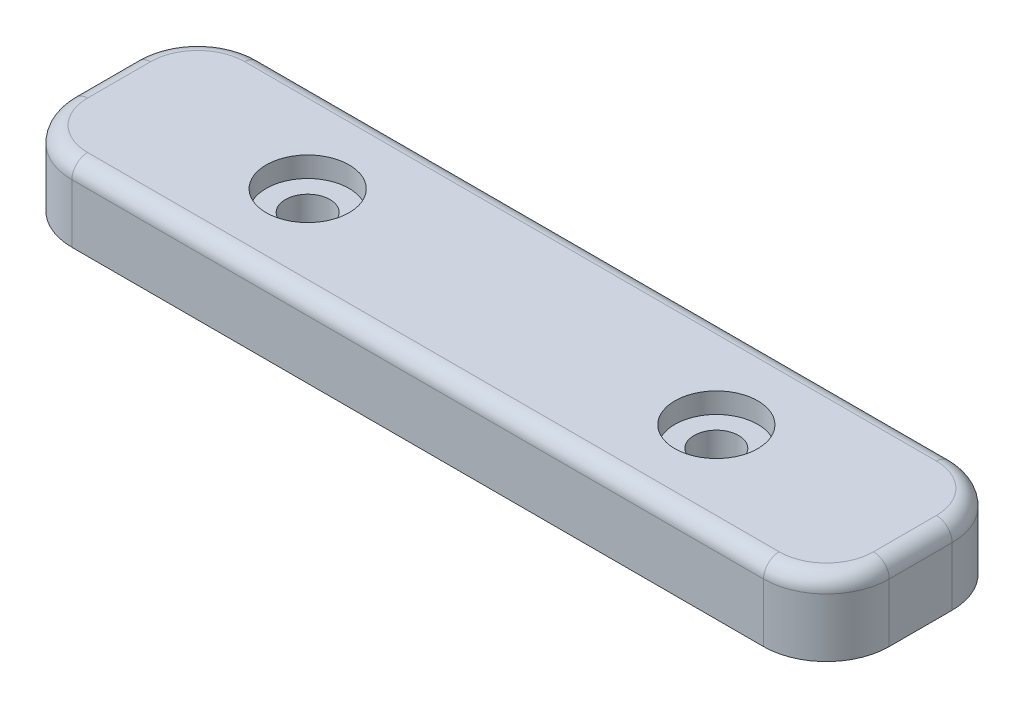
ISO-10303-21;
HEADER;
FILE_DESCRIPTION(('STEP AP214'),'2;1');
FILE_NAME('part.step','',(''),(''),'','','');
FILE_SCHEMA(('AUTOMOTIVE_DESIGN { 1 0 10303 214 1 1 1 1 }'));
ENDSEC;
DATA;
#1=APPLICATION_CONTEXT('core data for automotive mechanical design processes');
#2=APPLICATION_PROTOCOL_DEFINITION('international standard','automotive_design',2000,#1);
#3=PRODUCT_CONTEXT('',#1,'mechanical');
#4=PRODUCT('Part','Part','',(#3));
#5=PRODUCT_RELATED_PRODUCT_CATEGORY('part','',(#4));
#6=PRODUCT_DEFINITION_FORMATION('','',#4);
#7=PRODUCT_DEFINITION_CONTEXT('part definition',#1,'design');
#8=PRODUCT_DEFINITION('design','',#6,#7);
#9=PRODUCT_DEFINITION_SHAPE('','',#8);
#10=(LENGTH_UNIT() NAMED_UNIT(*) SI_UNIT(.MILLI.,.METRE.));
#11=(NAMED_UNIT(*) PLANE_ANGLE_UNIT() SI_UNIT($,.RADIAN.));
#12=(NAMED_UNIT(*) SI_UNIT($,.STERADIAN.) SOLID_ANGLE_UNIT());
#13=UNCERTAINTY_MEASURE_WITH_UNIT(LENGTH_MEASURE(1.E-05),#10,'distance_accuracy_value','');
#14=(GEOMETRIC_REPRESENTATION_CONTEXT(3) GLOBAL_UNCERTAINTY_ASSIGNED_CONTEXT((#13)) GLOBAL_UNIT_ASSIGNED_CONTEXT((#10,
#11,#12)) REPRESENTATION_CONTEXT('',''));
#15=CARTESIAN_POINT('',(0.,0.,0.));
#16=DIRECTION('',(0.,0.,1.));
#17=DIRECTION('',(1.,0.,0.));
#18=AXIS2_PLACEMENT_3D('',#15,#16,#17);
#19=CARTESIAN_POINT('',(0.,6.,0.));
#20=DIRECTION('',(1.,0.,0.));
#21=DIRECTION('',(0.,0.,-1.));
#22=AXIS2_PLACEMENT_3D('',#19,#20,#21);
#23=PLANE('',#22);
#24=DIRECTION('',(0.,-1.,0.));
#25=VECTOR('',#24,1.);
#26=CARTESIAN_POINT('',(0.,6.,10.16));
#27=LINE('',#26,#25);
#28=CARTESIAN_POINT('',(0.,0.,10.16));
#29=VERTEX_POINT('',#28);
#30=CARTESIAN_POINT('',(0.,4.73,10.16));
#31=VERTEX_POINT('',#30);
#32=EDGE_CURVE('E143',#29,#31,#27,.F.);
#33=ORIENTED_EDGE('',*,*,#32,.T.);
#34=DIRECTION('',(0.,0.,1.));
#35=VECTOR('',#34,1.);
#36=CARTESIAN_POINT('',(0.,4.73,5.08));
#37=LINE('',#36,#35);
#38=CARTESIAN_POINT('',(0.,4.73,5.08));
#39=VERTEX_POINT('',#38);
#40=EDGE_CURVE('E200',#31,#39,#37,.F.);
#41=ORIENTED_EDGE('',*,*,#40,.T.);
#42=DIRECTION('',(0.,-1.,0.));
#43=VECTOR('',#42,1.);
#44=CARTESIAN_POINT('',(0.,6.,5.08));
#45=LINE('',#44,#43);
#46=CARTESIAN_POINT('',(0.,0.,5.08));
#47=VERTEX_POINT('',#46);
#48=EDGE_CURVE('E147',#39,#47,#45,.T.);
#49=ORIENTED_EDGE('',*,*,#48,.T.);
#50=DIRECTION('',(0.,0.,1.));
#51=VECTOR('',#50,1.);
#52=CARTESIAN_POINT('',(0.,0.,0.));
#53=LINE('',#52,#51);
#54=EDGE_CURVE('E155',#47,#29,#53,.T.);
#55=ORIENTED_EDGE('',*,*,#54,.T.);
#56=EDGE_LOOP('',(#33,#41,#49,#55));
#57=FACE_BOUND('',#56,.T.);
#58=ADVANCED_FACE('F36',(#57),#23,.F.);
#59=CARTESIAN_POINT('',(0.,6.,15.24));
#60=DIRECTION('',(0.,0.,-1.));
#61=DIRECTION('',(-1.,0.,0.));
#62=AXIS2_PLACEMENT_3D('',#59,#60,#61);
#63=PLANE('',#62);
#64=DIRECTION('',(0.,-1.,0.));
#65=VECTOR('',#64,1.);
#66=CARTESIAN_POINT('',(60.96,6.,15.24));
#67=LINE('',#66,#65);
#68=CARTESIAN_POINT('',(60.96,0.,15.24));
#69=VERTEX_POINT('',#68);
#70=CARTESIAN_POINT('',(60.96,4.73,15.24));
#71=VERTEX_POINT('',#70);
#72=EDGE_CURVE('E137',#69,#71,#67,.F.);
#73=ORIENTED_EDGE('',*,*,#72,.T.);
#74=DIRECTION('',(1.,0.,0.));
#75=VECTOR('',#74,1.);
#76=CARTESIAN_POINT('',(5.08,4.73,15.24));
#77=LINE('',#76,#75);
#78=CARTESIAN_POINT('',(5.08,4.73,15.24));
#79=VERTEX_POINT('',#78);
#80=EDGE_CURVE('E11',#71,#79,#77,.F.);
#81=ORIENTED_EDGE('',*,*,#80,.T.);
#82=DIRECTION('',(0.,-1.,0.));
#83=VECTOR('',#82,1.);
#84=CARTESIAN_POINT('',(5.08,6.,15.24));
#85=LINE('',#84,#83);
#86=CARTESIAN_POINT('',(5.08,0.,15.24));
#87=VERTEX_POINT('',#86);
#88=EDGE_CURVE('E127',#79,#87,#85,.T.);
#89=ORIENTED_EDGE('',*,*,#88,.T.);
#90=DIRECTION('',(1.,0.,0.));
#91=VECTOR('',#90,1.);
#92=CARTESIAN_POINT('',(0.,0.,15.24));
#93=LINE('',#92,#91);
#94=EDGE_CURVE('E131',#87,#69,#93,.T.);
#95=ORIENTED_EDGE('',*,*,#94,.T.);
#96=EDGE_LOOP('',(#73,#81,#89,#95));
#97=FACE_BOUND('',#96,.T.);
#98=ADVANCED_FACE('F129',(#97),#63,.F.);
#99=CARTESIAN_POINT('',(66.04,6.,0.));
#100=DIRECTION('',(-1.,0.,0.));
#101=DIRECTION('',(0.,0.,1.));
#102=AXIS2_PLACEMENT_3D('',#99,#100,#101);
#103=PLANE('',#102);
#104=DIRECTION('',(0.,-1.,0.));
#105=VECTOR('',#104,1.);
#106=CARTESIAN_POINT('',(66.04,6.,5.08));
#107=LINE('',#106,#105);
#108=CARTESIAN_POINT('',(66.04,0.,5.08));
#109=VERTEX_POINT('',#108);
#110=CARTESIAN_POINT('',(66.04,4.73,5.08));
#111=VERTEX_POINT('',#110);
#112=EDGE_CURVE('E177',#109,#111,#107,.F.);
#113=ORIENTED_EDGE('',*,*,#112,.T.);
#114=DIRECTION('',(0.,0.,-1.));
#115=VECTOR('',#114,1.);
#116=CARTESIAN_POINT('',(66.04,4.73,10.16));
#117=LINE('',#116,#115);
#118=CARTESIAN_POINT('',(66.04,4.73,10.16));
#119=VERTEX_POINT('',#118);
#120=EDGE_CURVE('E60',#111,#119,#117,.F.);
#121=ORIENTED_EDGE('',*,*,#120,.T.);
#122=DIRECTION('',(0.,-1.,0.));
#123=VECTOR('',#122,1.);
#124=CARTESIAN_POINT('',(66.04,6.,10.16));
#125=LINE('',#124,#123);
#126=CARTESIAN_POINT('',(66.04,0.,10.16));
#127=VERTEX_POINT('',#126);
#128=EDGE_CURVE('E179',#119,#127,#125,.T.);
#129=ORIENTED_EDGE('',*,*,#128,.T.);
#130=DIRECTION('',(0.,0.,-1.));
#131=VECTOR('',#130,1.);
#132=CARTESIAN_POINT('',(66.04,0.,0.));
#133=LINE('',#132,#131);
#134=EDGE_CURVE('E154',#127,#109,#133,.T.);
#135=ORIENTED_EDGE('',*,*,#134,.T.);
#136=EDGE_LOOP('',(#113,#121,#129,#135));
#137=FACE_BOUND('',#136,.T.);
#138=ADVANCED_FACE('F292',(#137),#103,.F.);
#139=CARTESIAN_POINT('',(0.,6.,0.));
#140=DIRECTION('',(0.,0.,1.));
#141=DIRECTION('',(1.,0.,0.));
#142=AXIS2_PLACEMENT_3D('',#139,#140,#141);
#143=PLANE('',#142);
#144=DIRECTION('',(0.,-1.,0.));
#145=VECTOR('',#144,1.);
#146=CARTESIAN_POINT('',(5.08,6.,0.));
#147=LINE('',#146,#145);
#148=CARTESIAN_POINT('',(5.08,0.,0.));
#149=VERTEX_POINT('',#148);
#150=CARTESIAN_POINT('',(5.08,4.73,0.));
#151=VERTEX_POINT('',#150);
#152=EDGE_CURVE('E174',#149,#151,#147,.F.);
#153=ORIENTED_EDGE('',*,*,#152,.T.);
#154=DIRECTION('',(-1.,0.,0.));
#155=VECTOR('',#154,1.);
#156=CARTESIAN_POINT('',(60.96,4.73,0.));
#157=LINE('',#156,#155);
#158=CARTESIAN_POINT('',(60.96,4.73,0.));
#159=VERTEX_POINT('',#158);
#160=EDGE_CURVE('E204',#151,#159,#157,.F.);
#161=ORIENTED_EDGE('',*,*,#160,.T.);
#162=DIRECTION('',(0.,-1.,0.));
#163=VECTOR('',#162,1.);
#164=CARTESIAN_POINT('',(60.96,6.,0.));
#165=LINE('',#164,#163);
#166=CARTESIAN_POINT('',(60.96,0.,0.));
#167=VERTEX_POINT('',#166);
#168=EDGE_CURVE('E172',#159,#167,#165,.T.);
#169=ORIENTED_EDGE('',*,*,#168,.T.);
#170=DIRECTION('',(-1.,0.,0.));
#171=VECTOR('',#170,1.);
#172=CARTESIAN_POINT('',(0.,0.,0.));
#173=LINE('',#172,#171);
#174=EDGE_CURVE('E158',#167,#149,#173,.T.);
#175=ORIENTED_EDGE('',*,*,#174,.T.);
#176=EDGE_LOOP('',(#153,#161,#169,#175));
#177=FACE_BOUND('',#176,.T.);
#178=ADVANCED_FACE('F283',(#177),#143,.F.);
#179=CARTESIAN_POINT('',(0.,6.,0.));
#180=DIRECTION('',(0.,1.,0.));
#181=DIRECTION('',(0.,0.,1.));
#182=AXIS2_PLACEMENT_3D('',#179,#180,#181);
#183=PLANE('',#182);
#184=DIRECTION('',(0.,0.,1.));
#185=VECTOR('',#184,1.);
#186=CARTESIAN_POINT('',(1.27,6.,10.16));
#187=LINE('',#186,#185);
#188=CARTESIAN_POINT('',(1.27,6.,5.08));
#189=VERTEX_POINT('',#188);
#190=CARTESIAN_POINT('',(1.27,6.,10.16));
#191=VERTEX_POINT('',#190);
#192=EDGE_CURVE('E193',#189,#191,#187,.T.);
#193=ORIENTED_EDGE('',*,*,#192,.T.);
#194=CARTESIAN_POINT('',(5.08,6.,10.16));
#195=DIRECTION('',(0.,1.,0.));
#196=DIRECTION('',(0.,0.,1.));
#197=AXIS2_PLACEMENT_3D('',#194,#195,#196);
#198=CIRCLE('',#197,3.81);
#199=CARTESIAN_POINT('',(5.08,6.,13.97));
#200=VERTEX_POINT('',#199);
#201=EDGE_CURVE('E195',#191,#200,#198,.T.);
#202=ORIENTED_EDGE('',*,*,#201,.T.);
#203=DIRECTION('',(1.,0.,0.));
#204=VECTOR('',#203,1.);
#205=CARTESIAN_POINT('',(60.96,6.,13.97));
#206=LINE('',#205,#204);
#207=CARTESIAN_POINT('',(60.96,6.,13.97));
#208=VERTEX_POINT('',#207);
#209=EDGE_CURVE('E181',#200,#208,#206,.T.);
#210=ORIENTED_EDGE('',*,*,#209,.T.);
#211=CARTESIAN_POINT('',(60.96,6.,10.16));
#212=DIRECTION('',(0.,1.,0.));
#213=DIRECTION('',(0.,0.,1.));
#214=AXIS2_PLACEMENT_3D('',#211,#212,#213);
#215=CIRCLE('',#214,3.81);
#216=CARTESIAN_POINT('',(64.77,6.,10.16));
#217=VERTEX_POINT('',#216);
#218=EDGE_CURVE('E183',#208,#217,#215,.T.);
#219=ORIENTED_EDGE('',*,*,#218,.T.);
#220=DIRECTION('',(0.,0.,-1.));
#221=VECTOR('',#220,1.);
#222=CARTESIAN_POINT('',(64.77,6.,5.08));
#223=LINE('',#222,#221);
#224=CARTESIAN_POINT('',(64.77,6.,5.08));
#225=VERTEX_POINT('',#224);
#226=EDGE_CURVE('E185',#217,#225,#223,.T.);
#227=ORIENTED_EDGE('',*,*,#226,.T.);
#228=CARTESIAN_POINT('',(60.96,6.,5.08));
#229=DIRECTION('',(0.,1.,0.));
#230=DIRECTION('',(0.,0.,1.));
#231=AXIS2_PLACEMENT_3D('',#228,#229,#230);
#232=CIRCLE('',#231,3.81);
#233=CARTESIAN_POINT('',(60.96,6.,1.27));
#234=VERTEX_POINT('',#233);
#235=EDGE_CURVE('E187',#225,#234,#232,.T.);
#236=ORIENTED_EDGE('',*,*,#235,.T.);
#237=DIRECTION('',(-1.,0.,0.));
#238=VECTOR('',#237,1.);
#239=CARTESIAN_POINT('',(5.08,6.,1.27));
#240=LINE('',#239,#238);
#241=CARTESIAN_POINT('',(5.08,6.,1.27));
#242=VERTEX_POINT('',#241);
#243=EDGE_CURVE('E189',#234,#242,#240,.T.);
#244=ORIENTED_EDGE('',*,*,#243,.T.);
#245=CARTESIAN_POINT('',(5.08,6.,5.08));
#246=DIRECTION('',(0.,1.,0.));
#247=DIRECTION('',(0.,0.,1.));
#248=AXIS2_PLACEMENT_3D('',#245,#246,#247);
#249=CIRCLE('',#248,3.81);
#250=EDGE_CURVE('E191',#242,#189,#249,.T.);
#251=ORIENTED_EDGE('',*,*,#250,.T.);
#252=EDGE_LOOP('',(#193,#202,#210,#219,#227,#236,#244,#251));
#253=FACE_BOUND('',#252,.T.);
#254=CARTESIAN_POINT('',(16.51,6.,7.62));
#255=DIRECTION('',(0.,1.,0.));
#256=DIRECTION('',(0.,0.,1.));
#257=AXIS2_PLACEMENT_3D('',#254,#255,#256);
#258=CIRCLE('',#257,3.35);
#259=CARTESIAN_POINT('',(16.51,6.,10.97));
#260=VERTEX_POINT('',#259);
#261=EDGE_CURVE('E231',#260,#260,#258,.T.);
#262=ORIENTED_EDGE('',*,*,#261,.F.);
#263=EDGE_LOOP('',(#262));
#264=FACE_BOUND('',#263,.T.);
#265=CARTESIAN_POINT('',(49.53,6.,7.62));
#266=DIRECTION('',(0.,1.,0.));
#267=DIRECTION('',(0.,0.,1.));
#268=AXIS2_PLACEMENT_3D('',#265,#266,#267);
#269=CIRCLE('',#268,3.35);
#270=CARTESIAN_POINT('',(49.53,6.,10.97));
#271=VERTEX_POINT('',#270);
#272=EDGE_CURVE('E250',#271,#271,#269,.T.);
#273=ORIENTED_EDGE('',*,*,#272,.F.);
#274=EDGE_LOOP('',(#273));
#275=FACE_BOUND('',#274,.T.);
#276=ADVANCED_FACE('F281',(#253,#264,#275),#183,.T.);
#277=CARTESIAN_POINT('',(0.,0.,0.));
#278=DIRECTION('',(0.,1.,0.));
#279=DIRECTION('',(0.,0.,1.));
#280=AXIS2_PLACEMENT_3D('',#277,#278,#279);
#281=PLANE('',#280);
#282=CARTESIAN_POINT('',(16.51,0.,7.62));
#283=DIRECTION('',(0.,1.,0.));
#284=DIRECTION('',(0.,0.,1.));
#285=AXIS2_PLACEMENT_3D('',#282,#283,#284);
#286=CIRCLE('',#285,1.8);
#287=CARTESIAN_POINT('',(16.51,0.,9.42));
#288=VERTEX_POINT('',#287);
#289=EDGE_CURVE('E247',#288,#288,#286,.T.);
#290=ORIENTED_EDGE('',*,*,#289,.T.);
#291=EDGE_LOOP('',(#290));
#292=FACE_BOUND('',#291,.T.);
#293=CARTESIAN_POINT('',(49.53,0.,7.62));
#294=DIRECTION('',(0.,1.,0.));
#295=DIRECTION('',(0.,0.,1.));
#296=AXIS2_PLACEMENT_3D('',#293,#294,#295);
#297=CIRCLE('',#296,1.8);
#298=CARTESIAN_POINT('',(49.53,0.,9.41999999999999));
#299=VERTEX_POINT('',#298);
#300=EDGE_CURVE('E160',#299,#299,#297,.T.);
#301=ORIENTED_EDGE('',*,*,#300,.T.);
#302=EDGE_LOOP('',(#301));
#303=FACE_BOUND('',#302,.T.);
#304=ORIENTED_EDGE('',*,*,#94,.F.);
#305=CARTESIAN_POINT('',(5.08,0.,10.16));
#306=DIRECTION('',(0.,1.,0.));
#307=DIRECTION('',(0.,0.,1.));
#308=AXIS2_PLACEMENT_3D('',#305,#306,#307);
#309=CIRCLE('',#308,5.08);
#310=EDGE_CURVE('E140',#87,#29,#309,.F.);
#311=ORIENTED_EDGE('',*,*,#310,.T.);
#312=ORIENTED_EDGE('',*,*,#54,.F.);
#313=CARTESIAN_POINT('',(5.08,0.,5.08));
#314=DIRECTION('',(0.,1.,0.));
#315=DIRECTION('',(0.,0.,1.));
#316=AXIS2_PLACEMENT_3D('',#313,#314,#315);
#317=CIRCLE('',#316,5.08);
#318=EDGE_CURVE('E148',#47,#149,#317,.F.);
#319=ORIENTED_EDGE('',*,*,#318,.T.);
#320=ORIENTED_EDGE('',*,*,#174,.F.);
#321=CARTESIAN_POINT('',(60.96,0.,5.08));
#322=DIRECTION('',(0.,1.,0.));
#323=DIRECTION('',(0.,0.,1.));
#324=AXIS2_PLACEMENT_3D('',#321,#322,#323);
#325=CIRCLE('',#324,5.08);
#326=EDGE_CURVE('E136',#167,#109,#325,.F.);
#327=ORIENTED_EDGE('',*,*,#326,.T.);
#328=ORIENTED_EDGE('',*,*,#134,.F.);
#329=CARTESIAN_POINT('',(60.96,0.,10.16));
#330=DIRECTION('',(0.,1.,0.));
#331=DIRECTION('',(0.,0.,1.));
#332=AXIS2_PLACEMENT_3D('',#329,#330,#331);
#333=CIRCLE('',#332,5.08);
#334=EDGE_CURVE('E153',#127,#69,#333,.F.);
#335=ORIENTED_EDGE('',*,*,#334,.T.);
#336=EDGE_LOOP('',(#304,#311,#312,#319,#320,#327,#328,#335));
#337=FACE_BOUND('',#336,.T.);
#338=ADVANCED_FACE('F150',(#292,#303,#337),#281,.F.);
#339=CARTESIAN_POINT('',(49.53,6.,7.62));
#340=DIRECTION('',(0.,1.,0.));
#341=DIRECTION('',(0.,0.,1.));
#342=AXIS2_PLACEMENT_3D('',#339,#340,#341);
#343=CYLINDRICAL_SURFACE('',#342,1.8);
#344=ORIENTED_EDGE('',*,*,#300,.F.);
#345=EDGE_LOOP('',(#344));
#346=FACE_BOUND('',#345,.T.);
#347=CARTESIAN_POINT('',(49.53,4.35,7.62));
#348=DIRECTION('',(0.,1.,0.));
#349=DIRECTION('',(0.,0.,1.));
#350=AXIS2_PLACEMENT_3D('',#347,#348,#349);
#351=CIRCLE('',#350,1.8);
#352=CARTESIAN_POINT('',(49.53,4.35,9.42));
#353=VERTEX_POINT('',#352);
#354=EDGE_CURVE('E256',#353,#353,#351,.T.);
#355=ORIENTED_EDGE('',*,*,#354,.T.);
#356=EDGE_LOOP('',(#355));
#357=FACE_BOUND('',#356,.T.);
#358=ADVANCED_FACE('F262',(#346,#357),#343,.F.);
#359=CARTESIAN_POINT('',(51.33,4.35,7.62));
#360=DIRECTION('',(0.,-1.,0.));
#361=DIRECTION('',(0.,0.,-1.));
#362=AXIS2_PLACEMENT_3D('',#359,#360,#361);
#363=PLANE('',#362);
#364=ORIENTED_EDGE('',*,*,#354,.F.);
#365=EDGE_LOOP('',(#364));
#366=FACE_BOUND('',#365,.T.);
#367=CARTESIAN_POINT('',(49.53,4.35,7.62));
#368=DIRECTION('',(0.,1.,0.));
#369=DIRECTION('',(0.,0.,1.));
#370=AXIS2_PLACEMENT_3D('',#367,#368,#369);
#371=CIRCLE('',#370,3.35);
#372=CARTESIAN_POINT('',(49.53,4.35,10.97));
#373=VERTEX_POINT('',#372);
#374=EDGE_CURVE('E253',#373,#373,#371,.T.);
#375=ORIENTED_EDGE('',*,*,#374,.T.);
#376=EDGE_LOOP('',(#375));
#377=FACE_BOUND('',#376,.T.);
#378=ADVANCED_FACE('F265',(#366,#377),#363,.F.);
#379=CARTESIAN_POINT('',(49.53,6.,7.62));
#380=DIRECTION('',(0.,1.,0.));
#381=DIRECTION('',(0.,0.,1.));
#382=AXIS2_PLACEMENT_3D('',#379,#380,#381);
#383=CYLINDRICAL_SURFACE('',#382,3.35);
#384=ORIENTED_EDGE('',*,*,#374,.F.);
#385=EDGE_LOOP('',(#384));
#386=FACE_BOUND('',#385,.T.);
#387=ORIENTED_EDGE('',*,*,#272,.T.);
#388=EDGE_LOOP('',(#387));
#389=FACE_BOUND('',#388,.T.);
#390=ADVANCED_FACE('F271',(#386,#389),#383,.F.);
#391=CARTESIAN_POINT('',(16.51,6.,7.62));
#392=DIRECTION('',(0.,1.,0.));
#393=DIRECTION('',(0.,0.,1.));
#394=AXIS2_PLACEMENT_3D('',#391,#392,#393);
#395=CYLINDRICAL_SURFACE('',#394,1.8);
#396=ORIENTED_EDGE('',*,*,#289,.F.);
#397=EDGE_LOOP('',(#396));
#398=FACE_BOUND('',#397,.T.);
#399=CARTESIAN_POINT('',(16.51,4.35,7.62));
#400=DIRECTION('',(0.,1.,0.));
#401=DIRECTION('',(0.,0.,1.));
#402=AXIS2_PLACEMENT_3D('',#399,#400,#401);
#403=CIRCLE('',#402,1.8);
#404=CARTESIAN_POINT('',(16.51,4.35,9.42));
#405=VERTEX_POINT('',#404);
#406=EDGE_CURVE('E242',#405,#405,#403,.T.);
#407=ORIENTED_EDGE('',*,*,#406,.T.);
#408=EDGE_LOOP('',(#407));
#409=FACE_BOUND('',#408,.T.);
#410=ADVANCED_FACE('F277',(#398,#409),#395,.F.);
#411=CARTESIAN_POINT('',(18.31,4.35,7.62));
#412=DIRECTION('',(0.,-1.,0.));
#413=DIRECTION('',(0.,0.,-1.));
#414=AXIS2_PLACEMENT_3D('',#411,#412,#413);
#415=PLANE('',#414);
#416=ORIENTED_EDGE('',*,*,#406,.F.);
#417=EDGE_LOOP('',(#416));
#418=FACE_BOUND('',#417,.T.);
#419=CARTESIAN_POINT('',(16.51,4.35,7.62));
#420=DIRECTION('',(0.,1.,0.));
#421=DIRECTION('',(0.,0.,1.));
#422=AXIS2_PLACEMENT_3D('',#419,#420,#421);
#423=CIRCLE('',#422,3.35);
#424=CARTESIAN_POINT('',(16.51,4.35,10.97));
#425=VERTEX_POINT('',#424);
#426=EDGE_CURVE('E237',#425,#425,#423,.T.);
#427=ORIENTED_EDGE('',*,*,#426,.T.);
#428=EDGE_LOOP('',(#427));
#429=FACE_BOUND('',#428,.T.);
#430=ADVANCED_FACE('F462',(#418,#429),#415,.F.);
#431=CARTESIAN_POINT('',(16.51,6.,7.62));
#432=DIRECTION('',(0.,1.,0.));
#433=DIRECTION('',(0.,0.,1.));
#434=AXIS2_PLACEMENT_3D('',#431,#432,#433);
#435=CYLINDRICAL_SURFACE('',#434,3.35);
#436=ORIENTED_EDGE('',*,*,#426,.F.);
#437=EDGE_LOOP('',(#436));
#438=FACE_BOUND('',#437,.T.);
#439=ORIENTED_EDGE('',*,*,#261,.T.);
#440=EDGE_LOOP('',(#439));
#441=FACE_BOUND('',#440,.T.);
#442=ADVANCED_FACE('F308',(#438,#441),#435,.F.);
#443=CARTESIAN_POINT('',(5.08,6.,10.16));
#444=DIRECTION('',(0.,-1.,0.));
#445=DIRECTION('',(0.,0.,-1.));
#446=AXIS2_PLACEMENT_3D('',#443,#444,#445);
#447=CYLINDRICAL_SURFACE('',#446,5.08);
#448=ORIENTED_EDGE('',*,*,#88,.F.);
#449=CARTESIAN_POINT('',(5.08,4.73,10.16));
#450=DIRECTION('',(0.,1.,0.));
#451=DIRECTION('',(0.,0.,1.));
#452=AXIS2_PLACEMENT_3D('',#449,#450,#451);
#453=CIRCLE('',#452,5.08);
#454=EDGE_CURVE('E198',#79,#31,#453,.F.);
#455=ORIENTED_EDGE('',*,*,#454,.T.);
#456=ORIENTED_EDGE('',*,*,#32,.F.);
#457=ORIENTED_EDGE('',*,*,#310,.F.);
#458=EDGE_LOOP('',(#448,#455,#456,#457));
#459=FACE_BOUND('',#458,.T.);
#460=ADVANCED_FACE('F141',(#459),#447,.T.);
#461=CARTESIAN_POINT('',(5.08,6.,5.08));
#462=DIRECTION('',(0.,-1.,0.));
#463=DIRECTION('',(0.,0.,-1.));
#464=AXIS2_PLACEMENT_3D('',#461,#462,#463);
#465=CYLINDRICAL_SURFACE('',#464,5.08);
#466=ORIENTED_EDGE('',*,*,#48,.F.);
#467=CARTESIAN_POINT('',(5.08,4.73,5.08));
#468=DIRECTION('',(0.,1.,0.));
#469=DIRECTION('',(0.,0.,1.));
#470=AXIS2_PLACEMENT_3D('',#467,#468,#469);
#471=CIRCLE('',#470,5.08);
#472=EDGE_CURVE('E202',#39,#151,#471,.F.);
#473=ORIENTED_EDGE('',*,*,#472,.T.);
#474=ORIENTED_EDGE('',*,*,#152,.F.);
#475=ORIENTED_EDGE('',*,*,#318,.F.);
#476=EDGE_LOOP('',(#466,#473,#474,#475));
#477=FACE_BOUND('',#476,.T.);
#478=ADVANCED_FACE('F307',(#477),#465,.T.);
#479=CARTESIAN_POINT('',(60.96,6.,10.16));
#480=DIRECTION('',(0.,-1.,0.));
#481=DIRECTION('',(0.,0.,-1.));
#482=AXIS2_PLACEMENT_3D('',#479,#480,#481);
#483=CYLINDRICAL_SURFACE('',#482,5.08);
#484=ORIENTED_EDGE('',*,*,#128,.F.);
#485=CARTESIAN_POINT('',(60.96,4.73,10.16));
#486=DIRECTION('',(0.,1.,0.));
#487=DIRECTION('',(0.,0.,1.));
#488=AXIS2_PLACEMENT_3D('',#485,#486,#487);
#489=CIRCLE('',#488,5.08);
#490=EDGE_CURVE('E45',#119,#71,#489,.F.);
#491=ORIENTED_EDGE('',*,*,#490,.T.);
#492=ORIENTED_EDGE('',*,*,#72,.F.);
#493=ORIENTED_EDGE('',*,*,#334,.F.);
#494=EDGE_LOOP('',(#484,#491,#492,#493));
#495=FACE_BOUND('',#494,.T.);
#496=ADVANCED_FACE('F311',(#495),#483,.T.);
#497=CARTESIAN_POINT('',(60.96,6.,5.08));
#498=DIRECTION('',(0.,-1.,0.));
#499=DIRECTION('',(0.,0.,-1.));
#500=AXIS2_PLACEMENT_3D('',#497,#498,#499);
#501=CYLINDRICAL_SURFACE('',#500,5.08);
#502=ORIENTED_EDGE('',*,*,#168,.F.);
#503=CARTESIAN_POINT('',(60.96,4.73,5.08));
#504=DIRECTION('',(0.,1.,0.));
#505=DIRECTION('',(0.,0.,1.));
#506=AXIS2_PLACEMENT_3D('',#503,#504,#505);
#507=CIRCLE('',#506,5.08);
#508=EDGE_CURVE('E206',#159,#111,#507,.F.);
#509=ORIENTED_EDGE('',*,*,#508,.T.);
#510=ORIENTED_EDGE('',*,*,#112,.F.);
#511=ORIENTED_EDGE('',*,*,#326,.F.);
#512=EDGE_LOOP('',(#502,#509,#510,#511));
#513=FACE_BOUND('',#512,.T.);
#514=ADVANCED_FACE('F315',(#513),#501,.T.);
#515=CARTESIAN_POINT('',(60.96,4.73,5.08));
#516=DIRECTION('',(0.,1.,0.));
#517=DIRECTION('',(0.,0.,1.));
#518=AXIS2_PLACEMENT_3D('',#515,#516,#517);
#519=TOROIDAL_SURFACE('',#518,3.81,1.27);
#520=CARTESIAN_POINT('',(64.77,4.73,5.08));
#521=DIRECTION('',(0.,0.,1.));
#522=DIRECTION('',(1.,0.,0.));
#523=AXIS2_PLACEMENT_3D('',#520,#521,#522);
#524=CIRCLE('',#523,1.27);
#525=EDGE_CURVE('E225',#111,#225,#524,.T.);
#526=ORIENTED_EDGE('',*,*,#525,.F.);
#527=ORIENTED_EDGE('',*,*,#508,.F.);
#528=CARTESIAN_POINT('',(60.96,4.73,1.27));
#529=DIRECTION('',(-1.,0.,0.));
#530=DIRECTION('',(0.,0.,1.));
#531=AXIS2_PLACEMENT_3D('',#528,#529,#530);
#532=CIRCLE('',#531,1.27);
#533=EDGE_CURVE('E40',#234,#159,#532,.T.);
#534=ORIENTED_EDGE('',*,*,#533,.F.);
#535=ORIENTED_EDGE('',*,*,#235,.F.);
#536=EDGE_LOOP('',(#526,#527,#534,#535));
#537=FACE_BOUND('',#536,.T.);
#538=ADVANCED_FACE('F38',(#537),#519,.T.);
#539=CARTESIAN_POINT('',(0.,4.73,1.27));
#540=DIRECTION('',(1.,0.,0.));
#541=DIRECTION('',(0.,0.,-1.));
#542=AXIS2_PLACEMENT_3D('',#539,#540,#541);
#543=CYLINDRICAL_SURFACE('',#542,1.27);
#544=ORIENTED_EDGE('',*,*,#533,.T.);
#545=ORIENTED_EDGE('',*,*,#160,.F.);
#546=CARTESIAN_POINT('',(5.08,4.73,1.27));
#547=DIRECTION('',(-1.,0.,0.));
#548=DIRECTION('',(0.,0.,1.));
#549=AXIS2_PLACEMENT_3D('',#546,#547,#548);
#550=CIRCLE('',#549,1.27);
#551=EDGE_CURVE('E223',#242,#151,#550,.T.);
#552=ORIENTED_EDGE('',*,*,#551,.F.);
#553=ORIENTED_EDGE('',*,*,#243,.F.);
#554=EDGE_LOOP('',(#544,#545,#552,#553));
#555=FACE_BOUND('',#554,.T.);
#556=ADVANCED_FACE('F341',(#555),#543,.T.);
#557=CARTESIAN_POINT('',(64.77,4.73,0.));
#558=DIRECTION('',(0.,0.,1.));
#559=DIRECTION('',(1.,0.,0.));
#560=AXIS2_PLACEMENT_3D('',#557,#558,#559);
#561=CYLINDRICAL_SURFACE('',#560,1.27);
#562=ORIENTED_EDGE('',*,*,#525,.T.);
#563=ORIENTED_EDGE('',*,*,#226,.F.);
#564=CARTESIAN_POINT('',(64.77,4.73,10.16));
#565=DIRECTION('',(0.,0.,1.));
#566=DIRECTION('',(1.,0.,0.));
#567=AXIS2_PLACEMENT_3D('',#564,#565,#566);
#568=CIRCLE('',#567,1.27);
#569=EDGE_CURVE('E220',#119,#217,#568,.T.);
#570=ORIENTED_EDGE('',*,*,#569,.F.);
#571=ORIENTED_EDGE('',*,*,#120,.F.);
#572=EDGE_LOOP('',(#562,#563,#570,#571));
#573=FACE_BOUND('',#572,.T.);
#574=ADVANCED_FACE('F338',(#573),#561,.T.);
#575=CARTESIAN_POINT('',(5.08,4.73,5.08));
#576=DIRECTION('',(0.,1.,0.));
#577=DIRECTION('',(0.,0.,1.));
#578=AXIS2_PLACEMENT_3D('',#575,#576,#577);
#579=TOROIDAL_SURFACE('',#578,3.81,1.27);
#580=ORIENTED_EDGE('',*,*,#551,.T.);
#581=ORIENTED_EDGE('',*,*,#472,.F.);
#582=CARTESIAN_POINT('',(1.27,4.73,5.08));
#583=DIRECTION('',(0.,0.,1.));
#584=DIRECTION('',(1.,0.,0.));
#585=AXIS2_PLACEMENT_3D('',#582,#583,#584);
#586=CIRCLE('',#585,1.27);
#587=EDGE_CURVE('E217',#189,#39,#586,.T.);
#588=ORIENTED_EDGE('',*,*,#587,.F.);
#589=ORIENTED_EDGE('',*,*,#250,.F.);
#590=EDGE_LOOP('',(#580,#581,#588,#589));
#591=FACE_BOUND('',#590,.T.);
#592=ADVANCED_FACE('F334',(#591),#579,.T.);
#593=CARTESIAN_POINT('',(60.96,4.73,10.16));
#594=DIRECTION('',(0.,1.,0.));
#595=DIRECTION('',(0.,0.,1.));
#596=AXIS2_PLACEMENT_3D('',#593,#594,#595);
#597=TOROIDAL_SURFACE('',#596,3.81,1.27);
#598=ORIENTED_EDGE('',*,*,#569,.T.);
#599=ORIENTED_EDGE('',*,*,#218,.F.);
#600=CARTESIAN_POINT('',(60.96,4.73,13.97));
#601=DIRECTION('',(-1.,0.,0.));
#602=DIRECTION('',(0.,0.,1.));
#603=AXIS2_PLACEMENT_3D('',#600,#601,#602);
#604=CIRCLE('',#603,1.27);
#605=EDGE_CURVE('E214',#71,#208,#604,.T.);
#606=ORIENTED_EDGE('',*,*,#605,.F.);
#607=ORIENTED_EDGE('',*,*,#490,.F.);
#608=EDGE_LOOP('',(#598,#599,#606,#607));
#609=FACE_BOUND('',#608,.T.);
#610=ADVANCED_FACE('F330',(#609),#597,.T.);
#611=CARTESIAN_POINT('',(1.27,4.73,0.));
#612=DIRECTION('',(0.,0.,-1.));
#613=DIRECTION('',(-1.,0.,0.));
#614=AXIS2_PLACEMENT_3D('',#611,#612,#613);
#615=CYLINDRICAL_SURFACE('',#614,1.27);
#616=ORIENTED_EDGE('',*,*,#587,.T.);
#617=ORIENTED_EDGE('',*,*,#40,.F.);
#618=CARTESIAN_POINT('',(1.27,4.73,10.16));
#619=DIRECTION('',(0.,0.,1.));
#620=DIRECTION('',(1.,0.,0.));
#621=AXIS2_PLACEMENT_3D('',#618,#619,#620);
#622=CIRCLE('',#621,1.27);
#623=EDGE_CURVE('E212',#191,#31,#622,.T.);
#624=ORIENTED_EDGE('',*,*,#623,.F.);
#625=ORIENTED_EDGE('',*,*,#192,.F.);
#626=EDGE_LOOP('',(#616,#617,#624,#625));
#627=FACE_BOUND('',#626,.T.);
#628=ADVANCED_FACE('F326',(#627),#615,.T.);
#629=CARTESIAN_POINT('',(0.,4.73,13.97));
#630=DIRECTION('',(-1.,0.,0.));
#631=DIRECTION('',(0.,0.,1.));
#632=AXIS2_PLACEMENT_3D('',#629,#630,#631);
#633=CYLINDRICAL_SURFACE('',#632,1.27);
#634=ORIENTED_EDGE('',*,*,#605,.T.);
#635=ORIENTED_EDGE('',*,*,#209,.F.);
#636=CARTESIAN_POINT('',(5.08,4.73,13.97));
#637=DIRECTION('',(-1.,0.,0.));
#638=DIRECTION('',(0.,0.,1.));
#639=AXIS2_PLACEMENT_3D('',#636,#637,#638);
#640=CIRCLE('',#639,1.27);
#641=EDGE_CURVE('E210',#79,#200,#640,.T.);
#642=ORIENTED_EDGE('',*,*,#641,.F.);
#643=ORIENTED_EDGE('',*,*,#80,.F.);
#644=EDGE_LOOP('',(#634,#635,#642,#643));
#645=FACE_BOUND('',#644,.T.);
#646=ADVANCED_FACE('F322',(#645),#633,.T.);
#647=CARTESIAN_POINT('',(5.08,4.73,10.16));
#648=DIRECTION('',(0.,1.,0.));
#649=DIRECTION('',(0.,0.,1.));
#650=AXIS2_PLACEMENT_3D('',#647,#648,#649);
#651=TOROIDAL_SURFACE('',#650,3.81,1.27);
#652=ORIENTED_EDGE('',*,*,#623,.T.);
#653=ORIENTED_EDGE('',*,*,#454,.F.);
#654=ORIENTED_EDGE('',*,*,#641,.T.);
#655=ORIENTED_EDGE('',*,*,#201,.F.);
#656=EDGE_LOOP('',(#652,#653,#654,#655));
#657=FACE_BOUND('',#656,.T.);
#658=ADVANCED_FACE('F319',(#657),#651,.T.);
#659=CLOSED_SHELL('',(#58,#98,#138,#178,#276,#338,#358,#378,#390,#410,#430,#442,#460,#478,#496,
#514,#538,#556,#574,#592,#610,#628,#646,#658));
#660=MANIFOLD_SOLID_BREP('B2',#659);
#661=ADVANCED_BREP_SHAPE_REPRESENTATION('',(#18,#660),#14);
#662=SHAPE_DEFINITION_REPRESENTATION(#9,#661);
ENDSEC;
END-ISO-10303-21;
